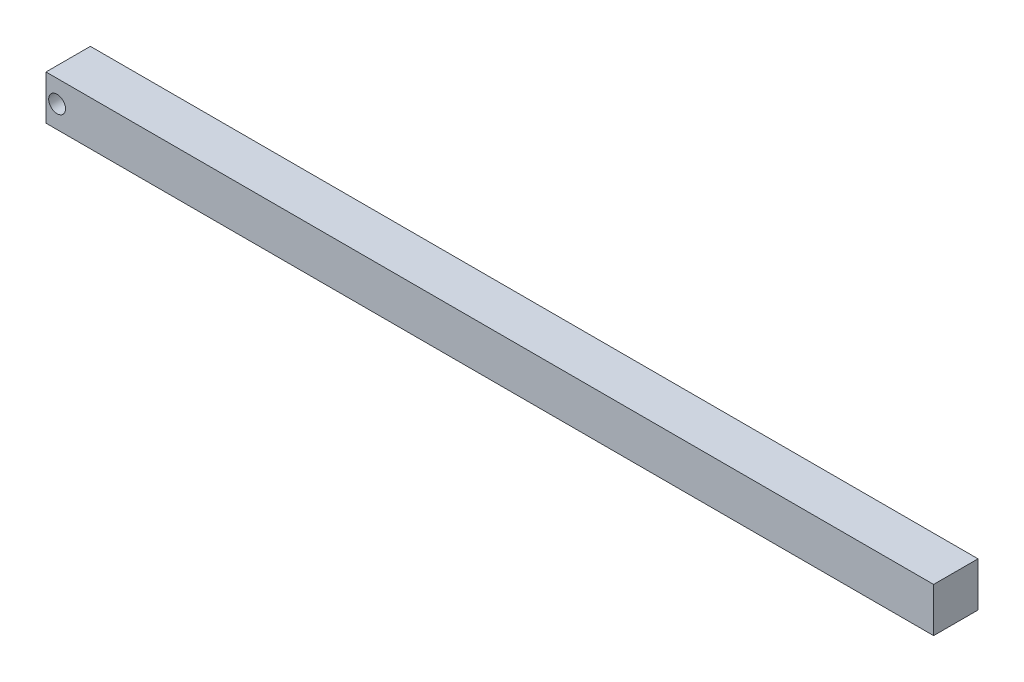
ISO-10303-21;
HEADER;
FILE_DESCRIPTION(('STEP AP214'),'2;1');
FILE_NAME('part.step','',(''),(''),'','','');
FILE_SCHEMA(('AUTOMOTIVE_DESIGN { 1 0 10303 214 1 1 1 1 }'));
ENDSEC;
DATA;
#1=APPLICATION_CONTEXT('core data for automotive mechanical design processes');
#2=APPLICATION_PROTOCOL_DEFINITION('international standard','automotive_design',2000,#1);
#3=PRODUCT_CONTEXT('',#1,'mechanical');
#4=PRODUCT('Part','Part','',(#3));
#5=PRODUCT_RELATED_PRODUCT_CATEGORY('part','',(#4));
#6=PRODUCT_DEFINITION_FORMATION('','',#4);
#7=PRODUCT_DEFINITION_CONTEXT('part definition',#1,'design');
#8=PRODUCT_DEFINITION('design','',#6,#7);
#9=PRODUCT_DEFINITION_SHAPE('','',#8);
#10=(LENGTH_UNIT() NAMED_UNIT(*) SI_UNIT(.MILLI.,.METRE.));
#11=(NAMED_UNIT(*) PLANE_ANGLE_UNIT() SI_UNIT($,.RADIAN.));
#12=(NAMED_UNIT(*) SI_UNIT($,.STERADIAN.) SOLID_ANGLE_UNIT());
#13=UNCERTAINTY_MEASURE_WITH_UNIT(LENGTH_MEASURE(1.E-05),#10,'distance_accuracy_value','');
#14=(GEOMETRIC_REPRESENTATION_CONTEXT(3) GLOBAL_UNCERTAINTY_ASSIGNED_CONTEXT((#13)) GLOBAL_UNIT_ASSIGNED_CONTEXT((#10,
#11,#12)) REPRESENTATION_CONTEXT('',''));
#15=CARTESIAN_POINT('',(0.,0.,0.));
#16=DIRECTION('',(0.,0.,1.));
#17=DIRECTION('',(1.,0.,0.));
#18=AXIS2_PLACEMENT_3D('',#15,#16,#17);
#19=CARTESIAN_POINT('',(-100.,5.,5.));
#20=DIRECTION('',(1.,0.,0.));
#21=DIRECTION('',(0.,0.,-1.));
#22=AXIS2_PLACEMENT_3D('',#19,#20,#21);
#23=PLANE('',#22);
#24=DIRECTION('',(0.,-1.,0.));
#25=VECTOR('',#24,1.);
#26=CARTESIAN_POINT('',(-100.,5.,-5.));
#27=LINE('',#26,#25);
#28=CARTESIAN_POINT('',(-100.,5.,-5.));
#29=VERTEX_POINT('',#28);
#30=CARTESIAN_POINT('',(-100.,-5.,-5.));
#31=VERTEX_POINT('',#30);
#32=EDGE_CURVE('E106',#29,#31,#27,.T.);
#33=ORIENTED_EDGE('',*,*,#32,.T.);
#34=DIRECTION('',(0.,0.,-1.));
#35=VECTOR('',#34,1.);
#36=CARTESIAN_POINT('',(-100.,-5.,5.));
#37=LINE('',#36,#35);
#38=CARTESIAN_POINT('',(-100.,-5.,5.));
#39=VERTEX_POINT('',#38);
#40=EDGE_CURVE('E11',#39,#31,#37,.T.);
#41=ORIENTED_EDGE('',*,*,#40,.F.);
#42=DIRECTION('',(0.,-1.,0.));
#43=VECTOR('',#42,1.);
#44=CARTESIAN_POINT('',(-100.,5.,5.));
#45=LINE('',#44,#43);
#46=CARTESIAN_POINT('',(-100.,5.,5.));
#47=VERTEX_POINT('',#46);
#48=EDGE_CURVE('E91',#47,#39,#45,.T.);
#49=ORIENTED_EDGE('',*,*,#48,.F.);
#50=DIRECTION('',(0.,0.,-1.));
#51=VECTOR('',#50,1.);
#52=CARTESIAN_POINT('',(-100.,5.,5.));
#53=LINE('',#52,#51);
#54=EDGE_CURVE('E105',#47,#29,#53,.T.);
#55=ORIENTED_EDGE('',*,*,#54,.T.);
#56=EDGE_LOOP('',(#33,#41,#49,#55));
#57=FACE_BOUND('',#56,.T.);
#58=ADVANCED_FACE('F41',(#57),#23,.F.);
#59=CARTESIAN_POINT('',(-100.,-5.,5.));
#60=DIRECTION('',(0.,1.,0.));
#61=DIRECTION('',(0.,0.,1.));
#62=AXIS2_PLACEMENT_3D('',#59,#60,#61);
#63=PLANE('',#62);
#64=DIRECTION('',(1.,0.,0.));
#65=VECTOR('',#64,1.);
#66=CARTESIAN_POINT('',(-100.,-5.,-5.));
#67=LINE('',#66,#65);
#68=CARTESIAN_POINT('',(100.,-5.,-5.));
#69=VERTEX_POINT('',#68);
#70=EDGE_CURVE('E100',#31,#69,#67,.T.);
#71=ORIENTED_EDGE('',*,*,#70,.T.);
#72=DIRECTION('',(0.,0.,-1.));
#73=VECTOR('',#72,1.);
#74=CARTESIAN_POINT('',(100.,-5.,5.));
#75=LINE('',#74,#73);
#76=CARTESIAN_POINT('',(100.,-5.,5.));
#77=VERTEX_POINT('',#76);
#78=EDGE_CURVE('E49',#77,#69,#75,.T.);
#79=ORIENTED_EDGE('',*,*,#78,.F.);
#80=DIRECTION('',(1.,0.,0.));
#81=VECTOR('',#80,1.);
#82=CARTESIAN_POINT('',(-100.,-5.,5.));
#83=LINE('',#82,#81);
#84=EDGE_CURVE('E86',#39,#77,#83,.T.);
#85=ORIENTED_EDGE('',*,*,#84,.F.);
#86=ORIENTED_EDGE('',*,*,#40,.T.);
#87=EDGE_LOOP('',(#71,#79,#85,#86));
#88=FACE_BOUND('',#87,.T.);
#89=ADVANCED_FACE('F96',(#88),#63,.F.);
#90=CARTESIAN_POINT('',(100.,-5.,5.));
#91=DIRECTION('',(-1.,0.,0.));
#92=DIRECTION('',(0.,0.,1.));
#93=AXIS2_PLACEMENT_3D('',#90,#91,#92);
#94=PLANE('',#93);
#95=DIRECTION('',(0.,1.,0.));
#96=VECTOR('',#95,1.);
#97=CARTESIAN_POINT('',(100.,-5.,-5.));
#98=LINE('',#97,#96);
#99=CARTESIAN_POINT('',(100.,5.,-5.));
#100=VERTEX_POINT('',#99);
#101=EDGE_CURVE('E73',#69,#100,#98,.T.);
#102=ORIENTED_EDGE('',*,*,#101,.T.);
#103=DIRECTION('',(0.,0.,-1.));
#104=VECTOR('',#103,1.);
#105=CARTESIAN_POINT('',(100.,5.,5.));
#106=LINE('',#105,#104);
#107=CARTESIAN_POINT('',(100.,5.,5.));
#108=VERTEX_POINT('',#107);
#109=EDGE_CURVE('E98',#108,#100,#106,.T.);
#110=ORIENTED_EDGE('',*,*,#109,.F.);
#111=DIRECTION('',(0.,1.,0.));
#112=VECTOR('',#111,1.);
#113=CARTESIAN_POINT('',(100.,-5.,5.));
#114=LINE('',#113,#112);
#115=EDGE_CURVE('E93',#77,#108,#114,.T.);
#116=ORIENTED_EDGE('',*,*,#115,.F.);
#117=ORIENTED_EDGE('',*,*,#78,.T.);
#118=EDGE_LOOP('',(#102,#110,#116,#117));
#119=FACE_BOUND('',#118,.T.);
#120=ADVANCED_FACE('F99',(#119),#94,.F.);
#121=CARTESIAN_POINT('',(100.,5.,5.));
#122=DIRECTION('',(0.,-1.,0.));
#123=DIRECTION('',(0.,0.,-1.));
#124=AXIS2_PLACEMENT_3D('',#121,#122,#123);
#125=PLANE('',#124);
#126=DIRECTION('',(-1.,0.,0.));
#127=VECTOR('',#126,1.);
#128=CARTESIAN_POINT('',(100.,5.,-5.));
#129=LINE('',#128,#127);
#130=EDGE_CURVE('E81',#100,#29,#129,.T.);
#131=ORIENTED_EDGE('',*,*,#130,.T.);
#132=ORIENTED_EDGE('',*,*,#54,.F.);
#133=DIRECTION('',(-1.,0.,0.));
#134=VECTOR('',#133,1.);
#135=CARTESIAN_POINT('',(100.,5.,5.));
#136=LINE('',#135,#134);
#137=EDGE_CURVE('E59',#108,#47,#136,.T.);
#138=ORIENTED_EDGE('',*,*,#137,.F.);
#139=ORIENTED_EDGE('',*,*,#109,.T.);
#140=EDGE_LOOP('',(#131,#132,#138,#139));
#141=FACE_BOUND('',#140,.T.);
#142=ADVANCED_FACE('F111',(#141),#125,.F.);
#143=CARTESIAN_POINT('',(0.,0.,5.));
#144=DIRECTION('',(0.,0.,1.));
#145=DIRECTION('',(1.,0.,0.));
#146=AXIS2_PLACEMENT_3D('',#143,#144,#145);
#147=PLANE('',#146);
#148=CARTESIAN_POINT('',(-97.5,0.,5.));
#149=DIRECTION('',(0.,0.,1.));
#150=DIRECTION('',(1.,0.,0.));
#151=AXIS2_PLACEMENT_3D('',#148,#149,#150);
#152=CIRCLE('',#151,1.9);
#153=CARTESIAN_POINT('',(-95.6,0.,5.));
#154=VERTEX_POINT('',#153);
#155=EDGE_CURVE('E108',#154,#154,#152,.T.);
#156=ORIENTED_EDGE('',*,*,#155,.F.);
#157=EDGE_LOOP('',(#156));
#158=FACE_BOUND('',#157,.T.);
#159=ORIENTED_EDGE('',*,*,#48,.T.);
#160=ORIENTED_EDGE('',*,*,#84,.T.);
#161=ORIENTED_EDGE('',*,*,#115,.T.);
#162=ORIENTED_EDGE('',*,*,#137,.T.);
#163=EDGE_LOOP('',(#159,#160,#161,#162));
#164=FACE_BOUND('',#163,.T.);
#165=ADVANCED_FACE('F90',(#158,#164),#147,.T.);
#166=CARTESIAN_POINT('',(0.,0.,-5.));
#167=DIRECTION('',(0.,0.,1.));
#168=DIRECTION('',(1.,0.,0.));
#169=AXIS2_PLACEMENT_3D('',#166,#167,#168);
#170=PLANE('',#169);
#171=CARTESIAN_POINT('',(-97.5,0.,-5.));
#172=DIRECTION('',(0.,0.,1.));
#173=DIRECTION('',(1.,0.,0.));
#174=AXIS2_PLACEMENT_3D('',#171,#172,#173);
#175=CIRCLE('',#174,1.9);
#176=CARTESIAN_POINT('',(-95.6,0.,-5.));
#177=VERTEX_POINT('',#176);
#178=EDGE_CURVE('E42',#177,#177,#175,.T.);
#179=ORIENTED_EDGE('',*,*,#178,.T.);
#180=EDGE_LOOP('',(#179));
#181=FACE_BOUND('',#180,.T.);
#182=ORIENTED_EDGE('',*,*,#32,.F.);
#183=ORIENTED_EDGE('',*,*,#130,.F.);
#184=ORIENTED_EDGE('',*,*,#101,.F.);
#185=ORIENTED_EDGE('',*,*,#70,.F.);
#186=EDGE_LOOP('',(#182,#183,#184,#185));
#187=FACE_BOUND('',#186,.T.);
#188=ADVANCED_FACE('F116',(#181,#187),#170,.F.);
#189=CARTESIAN_POINT('',(-97.5,0.,-15.));
#190=DIRECTION('',(0.,0.,1.));
#191=DIRECTION('',(1.,0.,0.));
#192=AXIS2_PLACEMENT_3D('',#189,#190,#191);
#193=CYLINDRICAL_SURFACE('',#192,1.9);
#194=ORIENTED_EDGE('',*,*,#155,.T.);
#195=EDGE_LOOP('',(#194));
#196=FACE_BOUND('',#195,.T.);
#197=ORIENTED_EDGE('',*,*,#178,.F.);
#198=EDGE_LOOP('',(#197));
#199=FACE_BOUND('',#198,.T.);
#200=ADVANCED_FACE('F130',(#196,#199),#193,.F.);
#201=CLOSED_SHELL('',(#58,#89,#120,#142,#165,#188,#200));
#202=MANIFOLD_SOLID_BREP('B2',#201);
#203=ADVANCED_BREP_SHAPE_REPRESENTATION('',(#18,#202),#14);
#204=SHAPE_DEFINITION_REPRESENTATION(#9,#203);
ENDSEC;
END-ISO-10303-21;
